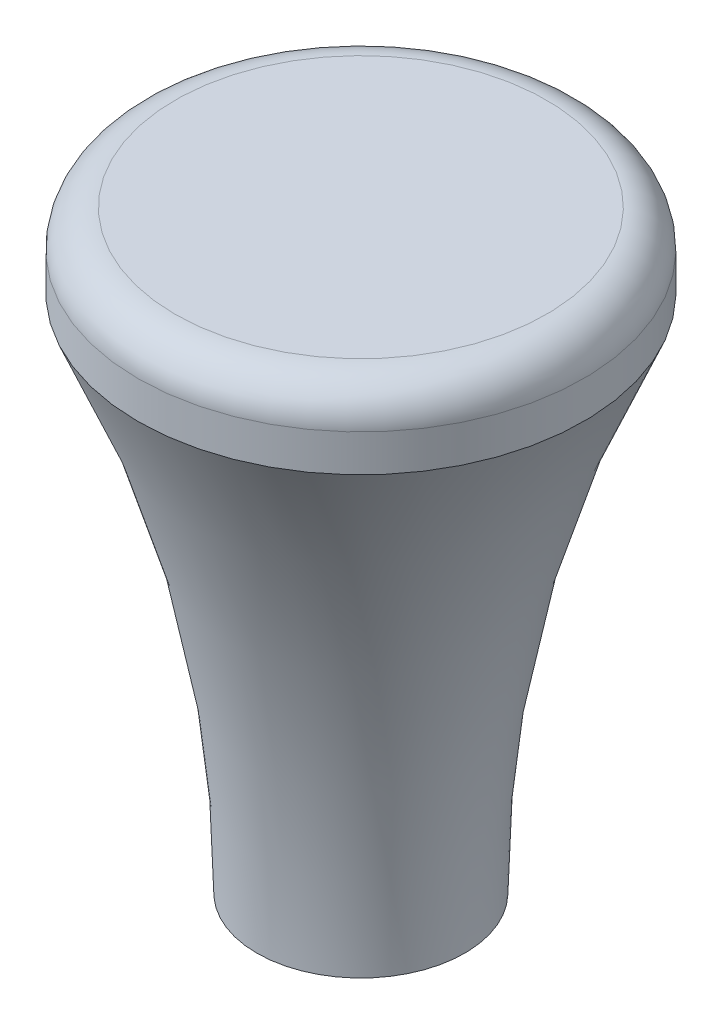
ISO-10303-21;
HEADER;
FILE_DESCRIPTION(('STEP AP214'),'2;1');
FILE_NAME('part.step','',(''),(''),'','','');
FILE_SCHEMA(('AUTOMOTIVE_DESIGN { 1 0 10303 214 1 1 1 1 }'));
ENDSEC;
DATA;
#1=APPLICATION_CONTEXT('core data for automotive mechanical design processes');
#2=APPLICATION_PROTOCOL_DEFINITION('international standard','automotive_design',2000,#1);
#3=PRODUCT_CONTEXT('',#1,'mechanical');
#4=PRODUCT('Part','Part','',(#3));
#5=PRODUCT_RELATED_PRODUCT_CATEGORY('part','',(#4));
#6=PRODUCT_DEFINITION_FORMATION('','',#4);
#7=PRODUCT_DEFINITION_CONTEXT('part definition',#1,'design');
#8=PRODUCT_DEFINITION('design','',#6,#7);
#9=PRODUCT_DEFINITION_SHAPE('','',#8);
#10=(LENGTH_UNIT() NAMED_UNIT(*) SI_UNIT(.MILLI.,.METRE.));
#11=(NAMED_UNIT(*) PLANE_ANGLE_UNIT() SI_UNIT($,.RADIAN.));
#12=(NAMED_UNIT(*) SI_UNIT($,.STERADIAN.) SOLID_ANGLE_UNIT());
#13=UNCERTAINTY_MEASURE_WITH_UNIT(LENGTH_MEASURE(1.E-05),#10,'distance_accuracy_value','');
#14=(GEOMETRIC_REPRESENTATION_CONTEXT(3) GLOBAL_UNCERTAINTY_ASSIGNED_CONTEXT((#13)) GLOBAL_UNIT_ASSIGNED_CONTEXT((#10,
#11,#12)) REPRESENTATION_CONTEXT('',''));
#15=CARTESIAN_POINT('',(0.,0.,0.));
#16=DIRECTION('',(0.,0.,1.));
#17=DIRECTION('',(1.,0.,0.));
#18=AXIS2_PLACEMENT_3D('',#15,#16,#17);
#19=CARTESIAN_POINT('',(0.,18.2499490024373,0.));
#20=DIRECTION('',(0.,1.,0.));
#21=DIRECTION('',(0.,0.,1.));
#22=AXIS2_PLACEMENT_3D('',#19,#20,#21);
#23=TOROIDAL_SURFACE('',#22,12.5,2.5);
#24=CARTESIAN_POINT('',(0.,18.2499490024373,0.));
#25=DIRECTION('',(0.,1.,0.));
#26=DIRECTION('',(0.,0.,1.));
#27=AXIS2_PLACEMENT_3D('',#24,#25,#26);
#28=CIRCLE('',#27,15.);
#29=CARTESIAN_POINT('',(0.,18.2499490024373,15.));
#30=VERTEX_POINT('',#29);
#31=EDGE_CURVE('E10',#30,#30,#28,.T.);
#32=ORIENTED_EDGE('',*,*,#31,.T.);
#33=EDGE_LOOP('',(#32));
#34=FACE_BOUND('',#33,.T.);
#35=CARTESIAN_POINT('',(0.,20.7499490024373,0.));
#36=DIRECTION('',(0.,1.,0.));
#37=DIRECTION('',(0.,0.,1.));
#38=AXIS2_PLACEMENT_3D('',#35,#36,#37);
#39=CIRCLE('',#38,12.5);
#40=CARTESIAN_POINT('',(0.,20.7499490024373,12.5));
#41=VERTEX_POINT('',#40);
#42=EDGE_CURVE('E48',#41,#41,#39,.T.);
#43=ORIENTED_EDGE('',*,*,#42,.F.);
#44=EDGE_LOOP('',(#43));
#45=FACE_BOUND('',#44,.T.);
#46=ADVANCED_FACE('F34',(#34,#45),#23,.T.);
#47=CARTESIAN_POINT('',(0.,28.85,0.));
#48=DIRECTION('',(0.,1.,0.));
#49=DIRECTION('',(0.,0.,1.));
#50=AXIS2_PLACEMENT_3D('',#47,#48,#49);
#51=CYLINDRICAL_SURFACE('',#50,15.);
#52=CARTESIAN_POINT('',(0.,15.7499490024373,0.));
#53=DIRECTION('',(0.,1.,0.));
#54=DIRECTION('',(0.,0.,1.));
#55=AXIS2_PLACEMENT_3D('',#52,#53,#54);
#56=CIRCLE('',#55,15.);
#57=CARTESIAN_POINT('',(0.,15.7499490024373,15.));
#58=VERTEX_POINT('',#57);
#59=EDGE_CURVE('E40',#58,#58,#56,.T.);
#60=ORIENTED_EDGE('',*,*,#59,.T.);
#61=EDGE_LOOP('',(#60));
#62=FACE_BOUND('',#61,.T.);
#63=ORIENTED_EDGE('',*,*,#31,.F.);
#64=EDGE_LOOP('',(#63));
#65=FACE_BOUND('',#64,.T.);
#66=ADVANCED_FACE('F78',(#62,#65),#51,.T.);
#67=CARTESIAN_POINT('',(0.,-19.2500509975627,0.));
#68=DIRECTION('',(0.,1.,0.));
#69=DIRECTION('',(0.,0.,1.));
#70=AXIS2_PLACEMENT_3D('',#67,#68,#69);
#71=TOROIDAL_SURFACE('',#70,87.5624999999999,80.5624999999999);
#72=CARTESIAN_POINT('',(0.,-19.2500509975627,0.));
#73=DIRECTION('',(0.,1.,0.));
#74=DIRECTION('',(0.,0.,1.));
#75=AXIS2_PLACEMENT_3D('',#72,#73,#74);
#76=CIRCLE('',#75,6.99999999999999);
#77=CARTESIAN_POINT('',(0.,-19.2500509975627,6.99999999999999));
#78=VERTEX_POINT('',#77);
#79=EDGE_CURVE('E44',#78,#78,#76,.T.);
#80=ORIENTED_EDGE('',*,*,#79,.T.);
#81=EDGE_LOOP('',(#80));
#82=FACE_BOUND('',#81,.T.);
#83=ORIENTED_EDGE('',*,*,#59,.F.);
#84=EDGE_LOOP('',(#83));
#85=FACE_BOUND('',#84,.T.);
#86=ADVANCED_FACE('F72',(#82,#85),#71,.F.);
#87=CARTESIAN_POINT('',(0.,-19.2500509975627,6.99999999999999));
#88=DIRECTION('',(0.,-1.,0.));
#89=DIRECTION('',(0.,0.,-1.));
#90=AXIS2_PLACEMENT_3D('',#87,#88,#89);
#91=PLANE('',#90);
#92=CARTESIAN_POINT('',(0.,-19.2500509975627,0.));
#93=DIRECTION('',(0.,-1.,0.));
#94=DIRECTION('',(0.,0.,-1.));
#95=AXIS2_PLACEMENT_3D('',#92,#93,#94);
#96=CIRCLE('',#95,1.);
#97=CARTESIAN_POINT('',(0.,-19.2500509975627,-1.));
#98=VERTEX_POINT('',#97);
#99=EDGE_CURVE('E54',#98,#98,#96,.T.);
#100=ORIENTED_EDGE('',*,*,#99,.F.);
#101=EDGE_LOOP('',(#100));
#102=FACE_BOUND('',#101,.T.);
#103=ORIENTED_EDGE('',*,*,#79,.F.);
#104=EDGE_LOOP('',(#103));
#105=FACE_BOUND('',#104,.T.);
#106=ADVANCED_FACE('F69',(#102,#105),#91,.T.);
#107=CARTESIAN_POINT('',(0.,20.7499490024373,12.5));
#108=DIRECTION('',(0.,1.,0.));
#109=DIRECTION('',(0.,0.,1.));
#110=AXIS2_PLACEMENT_3D('',#107,#108,#109);
#111=PLANE('',#110);
#112=ORIENTED_EDGE('',*,*,#42,.T.);
#113=EDGE_LOOP('',(#112));
#114=FACE_BOUND('',#113,.T.);
#115=ADVANCED_FACE('F65',(#114),#111,.T.);
#116=CARTESIAN_POINT('',(0.,-14.2500509975627,0.));
#117=DIRECTION('',(0.,-1.,0.));
#118=DIRECTION('',(0.,0.,-1.));
#119=AXIS2_PLACEMENT_3D('',#116,#117,#118);
#120=CYLINDRICAL_SURFACE('',#119,1.);
#121=CARTESIAN_POINT('',(0.,-14.2500509975627,0.));
#122=DIRECTION('',(0.,-1.,0.));
#123=DIRECTION('',(0.,0.,-1.));
#124=AXIS2_PLACEMENT_3D('',#121,#122,#123);
#125=CIRCLE('',#124,1.);
#126=CARTESIAN_POINT('',(0.,-14.2500509975627,-1.));
#127=VERTEX_POINT('',#126);
#128=EDGE_CURVE('E53',#127,#127,#125,.T.);
#129=ORIENTED_EDGE('',*,*,#128,.F.);
#130=EDGE_LOOP('',(#129));
#131=FACE_BOUND('',#130,.T.);
#132=ORIENTED_EDGE('',*,*,#99,.T.);
#133=EDGE_LOOP('',(#132));
#134=FACE_BOUND('',#133,.T.);
#135=ADVANCED_FACE('F62',(#131,#134),#120,.F.);
#136=CARTESIAN_POINT('',(0.,-14.2500509975627,0.));
#137=DIRECTION('',(0.,-1.,0.));
#138=DIRECTION('',(0.,0.,-1.));
#139=AXIS2_PLACEMENT_3D('',#136,#137,#138);
#140=PLANE('',#139);
#141=ORIENTED_EDGE('',*,*,#128,.T.);
#142=EDGE_LOOP('',(#141));
#143=FACE_BOUND('',#142,.T.);
#144=ADVANCED_FACE('F60',(#143),#140,.T.);
#145=CLOSED_SHELL('',(#46,#66,#86,#106,#115,#135,#144));
#146=MANIFOLD_SOLID_BREP('B2',#145);
#147=ADVANCED_BREP_SHAPE_REPRESENTATION('',(#18,#146),#14);
#148=SHAPE_DEFINITION_REPRESENTATION(#9,#147);
ENDSEC;
END-ISO-10303-21;
